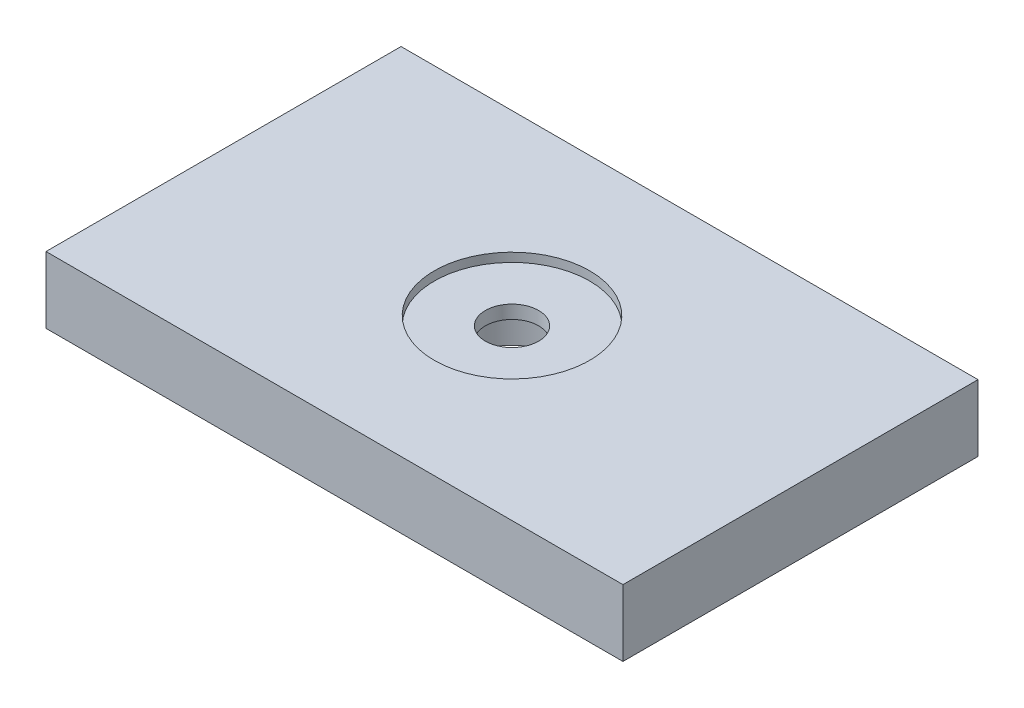
ISO-10303-21;
HEADER;
FILE_DESCRIPTION(('STEP AP214'),'2;1');
FILE_NAME('part.step','',(''),(''),'','','');
FILE_SCHEMA(('AUTOMOTIVE_DESIGN { 1 0 10303 214 1 1 1 1 }'));
ENDSEC;
DATA;
#1=APPLICATION_CONTEXT('core data for automotive mechanical design processes');
#2=APPLICATION_PROTOCOL_DEFINITION('international standard','automotive_design',2000,#1);
#3=PRODUCT_CONTEXT('',#1,'mechanical');
#4=PRODUCT('Part','Part','',(#3));
#5=PRODUCT_RELATED_PRODUCT_CATEGORY('part','',(#4));
#6=PRODUCT_DEFINITION_FORMATION('','',#4);
#7=PRODUCT_DEFINITION_CONTEXT('part definition',#1,'design');
#8=PRODUCT_DEFINITION('design','',#6,#7);
#9=PRODUCT_DEFINITION_SHAPE('','',#8);
#10=(LENGTH_UNIT() NAMED_UNIT(*) SI_UNIT(.MILLI.,.METRE.));
#11=(NAMED_UNIT(*) PLANE_ANGLE_UNIT() SI_UNIT($,.RADIAN.));
#12=(NAMED_UNIT(*) SI_UNIT($,.STERADIAN.) SOLID_ANGLE_UNIT());
#13=UNCERTAINTY_MEASURE_WITH_UNIT(LENGTH_MEASURE(1.E-05),#10,'distance_accuracy_value','');
#14=(GEOMETRIC_REPRESENTATION_CONTEXT(3) GLOBAL_UNCERTAINTY_ASSIGNED_CONTEXT((#13)) GLOBAL_UNIT_ASSIGNED_CONTEXT((#10,
#11,#12)) REPRESENTATION_CONTEXT('',''));
#15=CARTESIAN_POINT('',(0.,0.,0.));
#16=DIRECTION('',(0.,0.,1.));
#17=DIRECTION('',(1.,0.,0.));
#18=AXIS2_PLACEMENT_3D('',#15,#16,#17);
#19=CARTESIAN_POINT('',(65.,15.,-40.));
#20=DIRECTION('',(-1.,0.,0.));
#21=DIRECTION('',(0.,0.,1.));
#22=AXIS2_PLACEMENT_3D('',#19,#20,#21);
#23=PLANE('',#22);
#24=DIRECTION('',(0.,0.,-1.));
#25=VECTOR('',#24,1.);
#26=CARTESIAN_POINT('',(65.,0.,-40.));
#27=LINE('',#26,#25);
#28=CARTESIAN_POINT('',(65.,0.,40.));
#29=VERTEX_POINT('',#28);
#30=CARTESIAN_POINT('',(65.,0.,-40.));
#31=VERTEX_POINT('',#30);
#32=EDGE_CURVE('E115',#29,#31,#27,.T.);
#33=ORIENTED_EDGE('',*,*,#32,.T.);
#34=DIRECTION('',(0.,-1.,0.));
#35=VECTOR('',#34,1.);
#36=CARTESIAN_POINT('',(65.,15.,-40.));
#37=LINE('',#36,#35);
#38=CARTESIAN_POINT('',(65.,15.,-40.));
#39=VERTEX_POINT('',#38);
#40=EDGE_CURVE('E11',#39,#31,#37,.T.);
#41=ORIENTED_EDGE('',*,*,#40,.F.);
#42=DIRECTION('',(0.,0.,-1.));
#43=VECTOR('',#42,1.);
#44=CARTESIAN_POINT('',(65.,15.,-40.));
#45=LINE('',#44,#43);
#46=CARTESIAN_POINT('',(65.,15.,40.));
#47=VERTEX_POINT('',#46);
#48=EDGE_CURVE('E98',#47,#39,#45,.T.);
#49=ORIENTED_EDGE('',*,*,#48,.F.);
#50=DIRECTION('',(0.,-1.,0.));
#51=VECTOR('',#50,1.);
#52=CARTESIAN_POINT('',(65.,15.,40.));
#53=LINE('',#52,#51);
#54=EDGE_CURVE('E111',#47,#29,#53,.T.);
#55=ORIENTED_EDGE('',*,*,#54,.T.);
#56=EDGE_LOOP('',(#33,#41,#49,#55));
#57=FACE_BOUND('',#56,.T.);
#58=ADVANCED_FACE('F45',(#57),#23,.F.);
#59=CARTESIAN_POINT('',(-65.,15.,-40.));
#60=DIRECTION('',(0.,0.,1.));
#61=DIRECTION('',(1.,0.,0.));
#62=AXIS2_PLACEMENT_3D('',#59,#60,#61);
#63=PLANE('',#62);
#64=DIRECTION('',(-1.,0.,0.));
#65=VECTOR('',#64,1.);
#66=CARTESIAN_POINT('',(-65.,0.,-40.));
#67=LINE('',#66,#65);
#68=CARTESIAN_POINT('',(-65.,0.,-40.));
#69=VERTEX_POINT('',#68);
#70=EDGE_CURVE('E103',#31,#69,#67,.T.);
#71=ORIENTED_EDGE('',*,*,#70,.T.);
#72=DIRECTION('',(0.,-1.,0.));
#73=VECTOR('',#72,1.);
#74=CARTESIAN_POINT('',(-65.,15.,-40.));
#75=LINE('',#74,#73);
#76=CARTESIAN_POINT('',(-65.,15.,-40.));
#77=VERTEX_POINT('',#76);
#78=EDGE_CURVE('E55',#77,#69,#75,.T.);
#79=ORIENTED_EDGE('',*,*,#78,.F.);
#80=DIRECTION('',(-1.,0.,0.));
#81=VECTOR('',#80,1.);
#82=CARTESIAN_POINT('',(-65.,15.,-40.));
#83=LINE('',#82,#81);
#84=EDGE_CURVE('E93',#39,#77,#83,.T.);
#85=ORIENTED_EDGE('',*,*,#84,.F.);
#86=ORIENTED_EDGE('',*,*,#40,.T.);
#87=EDGE_LOOP('',(#71,#79,#85,#86));
#88=FACE_BOUND('',#87,.T.);
#89=ADVANCED_FACE('F102',(#88),#63,.F.);
#90=CARTESIAN_POINT('',(-65.,15.,-40.));
#91=DIRECTION('',(1.,0.,0.));
#92=DIRECTION('',(0.,0.,-1.));
#93=AXIS2_PLACEMENT_3D('',#90,#91,#92);
#94=PLANE('',#93);
#95=DIRECTION('',(0.,0.,1.));
#96=VECTOR('',#95,1.);
#97=CARTESIAN_POINT('',(-65.,0.,-40.));
#98=LINE('',#97,#96);
#99=CARTESIAN_POINT('',(-65.,0.,40.));
#100=VERTEX_POINT('',#99);
#101=EDGE_CURVE('E80',#69,#100,#98,.T.);
#102=ORIENTED_EDGE('',*,*,#101,.T.);
#103=DIRECTION('',(0.,-1.,0.));
#104=VECTOR('',#103,1.);
#105=CARTESIAN_POINT('',(-65.,15.,40.));
#106=LINE('',#105,#104);
#107=CARTESIAN_POINT('',(-65.,15.,40.));
#108=VERTEX_POINT('',#107);
#109=EDGE_CURVE('E105',#108,#100,#106,.T.);
#110=ORIENTED_EDGE('',*,*,#109,.F.);
#111=DIRECTION('',(0.,0.,1.));
#112=VECTOR('',#111,1.);
#113=CARTESIAN_POINT('',(-65.,15.,-40.));
#114=LINE('',#113,#112);
#115=EDGE_CURVE('E96',#77,#108,#114,.T.);
#116=ORIENTED_EDGE('',*,*,#115,.F.);
#117=ORIENTED_EDGE('',*,*,#78,.T.);
#118=EDGE_LOOP('',(#102,#110,#116,#117));
#119=FACE_BOUND('',#118,.T.);
#120=ADVANCED_FACE('F107',(#119),#94,.F.);
#121=CARTESIAN_POINT('',(-65.,15.,40.));
#122=DIRECTION('',(0.,0.,-1.));
#123=DIRECTION('',(-1.,0.,0.));
#124=AXIS2_PLACEMENT_3D('',#121,#122,#123);
#125=PLANE('',#124);
#126=DIRECTION('',(1.,0.,0.));
#127=VECTOR('',#126,1.);
#128=CARTESIAN_POINT('',(-65.,0.,40.));
#129=LINE('',#128,#127);
#130=EDGE_CURVE('E86',#100,#29,#129,.T.);
#131=ORIENTED_EDGE('',*,*,#130,.T.);
#132=ORIENTED_EDGE('',*,*,#54,.F.);
#133=DIRECTION('',(1.,0.,0.));
#134=VECTOR('',#133,1.);
#135=CARTESIAN_POINT('',(-65.,15.,40.));
#136=LINE('',#135,#134);
#137=EDGE_CURVE('E63',#108,#47,#136,.T.);
#138=ORIENTED_EDGE('',*,*,#137,.F.);
#139=ORIENTED_EDGE('',*,*,#109,.T.);
#140=EDGE_LOOP('',(#131,#132,#138,#139));
#141=FACE_BOUND('',#140,.T.);
#142=ADVANCED_FACE('F129',(#141),#125,.F.);
#143=CARTESIAN_POINT('',(0.,15.,0.));
#144=DIRECTION('',(0.,1.,0.));
#145=DIRECTION('',(0.,0.,1.));
#146=AXIS2_PLACEMENT_3D('',#143,#144,#145);
#147=PLANE('',#146);
#148=CARTESIAN_POINT('',(0.,15.,0.));
#149=DIRECTION('',(0.,1.,0.));
#150=DIRECTION('',(0.,0.,1.));
#151=AXIS2_PLACEMENT_3D('',#148,#149,#150);
#152=CIRCLE('',#151,17.5);
#153=CARTESIAN_POINT('',(0.,15.,17.5));
#154=VERTEX_POINT('',#153);
#155=EDGE_CURVE('E136',#154,#154,#152,.T.);
#156=ORIENTED_EDGE('',*,*,#155,.F.);
#157=EDGE_LOOP('',(#156));
#158=FACE_BOUND('',#157,.T.);
#159=ORIENTED_EDGE('',*,*,#48,.T.);
#160=ORIENTED_EDGE('',*,*,#84,.T.);
#161=ORIENTED_EDGE('',*,*,#115,.T.);
#162=ORIENTED_EDGE('',*,*,#137,.T.);
#163=EDGE_LOOP('',(#159,#160,#161,#162));
#164=FACE_BOUND('',#163,.T.);
#165=ADVANCED_FACE('F94',(#158,#164),#147,.T.);
#166=CARTESIAN_POINT('',(0.,0.,0.));
#167=DIRECTION('',(0.,1.,0.));
#168=DIRECTION('',(0.,0.,1.));
#169=AXIS2_PLACEMENT_3D('',#166,#167,#168);
#170=PLANE('',#169);
#171=CARTESIAN_POINT('',(0.,0.,0.));
#172=DIRECTION('',(0.,-1.,0.));
#173=DIRECTION('',(0.,0.,-1.));
#174=AXIS2_PLACEMENT_3D('',#171,#172,#173);
#175=CIRCLE('',#174,13.);
#176=CARTESIAN_POINT('',(0.,0.,-13.));
#177=VERTEX_POINT('',#176);
#178=EDGE_CURVE('E144',#177,#177,#175,.T.);
#179=ORIENTED_EDGE('',*,*,#178,.F.);
#180=EDGE_LOOP('',(#179));
#181=FACE_BOUND('',#180,.T.);
#182=ORIENTED_EDGE('',*,*,#32,.F.);
#183=ORIENTED_EDGE('',*,*,#130,.F.);
#184=ORIENTED_EDGE('',*,*,#101,.F.);
#185=ORIENTED_EDGE('',*,*,#70,.F.);
#186=EDGE_LOOP('',(#182,#183,#184,#185));
#187=FACE_BOUND('',#186,.T.);
#188=ADVANCED_FACE('F132',(#181,#187),#170,.F.);
#189=CARTESIAN_POINT('',(0.,13.,0.));
#190=DIRECTION('',(0.,1.,0.));
#191=DIRECTION('',(0.,0.,1.));
#192=AXIS2_PLACEMENT_3D('',#189,#190,#191);
#193=CYLINDRICAL_SURFACE('',#192,17.5);
#194=CARTESIAN_POINT('',(0.,13.,0.));
#195=DIRECTION('',(0.,1.,0.));
#196=DIRECTION('',(0.,0.,1.));
#197=AXIS2_PLACEMENT_3D('',#194,#195,#196);
#198=CIRCLE('',#197,17.5);
#199=CARTESIAN_POINT('',(0.,13.,17.5));
#200=VERTEX_POINT('',#199);
#201=EDGE_CURVE('E119',#200,#200,#198,.T.);
#202=ORIENTED_EDGE('',*,*,#201,.F.);
#203=EDGE_LOOP('',(#202));
#204=FACE_BOUND('',#203,.T.);
#205=ORIENTED_EDGE('',*,*,#155,.T.);
#206=EDGE_LOOP('',(#205));
#207=FACE_BOUND('',#206,.T.);
#208=ADVANCED_FACE('F176',(#204,#207),#193,.F.);
#209=CARTESIAN_POINT('',(0.,13.,0.));
#210=DIRECTION('',(0.,1.,0.));
#211=DIRECTION('',(0.,0.,1.));
#212=AXIS2_PLACEMENT_3D('',#209,#210,#211);
#213=PLANE('',#212);
#214=CARTESIAN_POINT('',(0.,13.,0.));
#215=DIRECTION('',(0.,1.,0.));
#216=DIRECTION('',(0.,0.,1.));
#217=AXIS2_PLACEMENT_3D('',#214,#215,#216);
#218=CIRCLE('',#217,6.);
#219=CARTESIAN_POINT('',(0.,13.,6.));
#220=VERTEX_POINT('',#219);
#221=EDGE_CURVE('E151',#220,#220,#218,.T.);
#222=ORIENTED_EDGE('',*,*,#221,.F.);
#223=EDGE_LOOP('',(#222));
#224=FACE_BOUND('',#223,.T.);
#225=ORIENTED_EDGE('',*,*,#201,.T.);
#226=EDGE_LOOP('',(#225));
#227=FACE_BOUND('',#226,.T.);
#228=ADVANCED_FACE('F171',(#224,#227),#213,.T.);
#229=CARTESIAN_POINT('',(0.,10.,0.));
#230=DIRECTION('',(0.,-1.,0.));
#231=DIRECTION('',(0.,0.,-1.));
#232=AXIS2_PLACEMENT_3D('',#229,#230,#231);
#233=CYLINDRICAL_SURFACE('',#232,13.);
#234=CARTESIAN_POINT('',(0.,10.,0.));
#235=DIRECTION('',(0.,-1.,0.));
#236=DIRECTION('',(0.,0.,-1.));
#237=AXIS2_PLACEMENT_3D('',#234,#235,#236);
#238=CIRCLE('',#237,13.);
#239=CARTESIAN_POINT('',(0.,10.,-13.));
#240=VERTEX_POINT('',#239);
#241=EDGE_CURVE('E140',#240,#240,#238,.T.);
#242=ORIENTED_EDGE('',*,*,#241,.F.);
#243=EDGE_LOOP('',(#242));
#244=FACE_BOUND('',#243,.T.);
#245=ORIENTED_EDGE('',*,*,#178,.T.);
#246=EDGE_LOOP('',(#245));
#247=FACE_BOUND('',#246,.T.);
#248=ADVANCED_FACE('F165',(#244,#247),#233,.F.);
#249=CARTESIAN_POINT('',(0.,10.,0.));
#250=DIRECTION('',(0.,-1.,0.));
#251=DIRECTION('',(0.,0.,-1.));
#252=AXIS2_PLACEMENT_3D('',#249,#250,#251);
#253=PLANE('',#252);
#254=CARTESIAN_POINT('',(0.,10.,0.));
#255=DIRECTION('',(0.,-1.,0.));
#256=DIRECTION('',(0.,0.,-1.));
#257=AXIS2_PLACEMENT_3D('',#254,#255,#256);
#258=CIRCLE('',#257,6.);
#259=CARTESIAN_POINT('',(0.,10.,6.));
#260=VERTEX_POINT('',#259);
#261=EDGE_CURVE('E48',#260,#260,#258,.T.);
#262=ORIENTED_EDGE('',*,*,#261,.F.);
#263=EDGE_LOOP('',(#262));
#264=FACE_BOUND('',#263,.T.);
#265=ORIENTED_EDGE('',*,*,#241,.T.);
#266=EDGE_LOOP('',(#265));
#267=FACE_BOUND('',#266,.T.);
#268=ADVANCED_FACE('F162',(#264,#267),#253,.T.);
#269=CARTESIAN_POINT('',(0.,0.,0.));
#270=DIRECTION('',(0.,1.,0.));
#271=DIRECTION('',(0.,0.,1.));
#272=AXIS2_PLACEMENT_3D('',#269,#270,#271);
#273=CYLINDRICAL_SURFACE('',#272,6.);
#274=CARTESIAN_POINT('',(0.,10.,6.));
#275=CARTESIAN_POINT('',(0.,10.03125,6.));
#276=CARTESIAN_POINT('',(0.,10.0625,6.));
#277=CARTESIAN_POINT('',(0.,10.125,6.));
#278=CARTESIAN_POINT('',(0.,10.15625,6.));
#279=CARTESIAN_POINT('',(0.,10.21875,6.));
#280=CARTESIAN_POINT('',(0.,10.25,6.));
#281=CARTESIAN_POINT('',(0.,10.3125,6.));
#282=CARTESIAN_POINT('',(0.,10.34375,6.));
#283=CARTESIAN_POINT('',(0.,10.40625,6.));
#284=CARTESIAN_POINT('',(0.,10.4375,6.));
#285=CARTESIAN_POINT('',(0.,10.5,6.));
#286=CARTESIAN_POINT('',(0.,10.53125,6.));
#287=CARTESIAN_POINT('',(0.,10.59375,6.));
#288=CARTESIAN_POINT('',(0.,10.625,6.));
#289=CARTESIAN_POINT('',(0.,10.6875,6.));
#290=CARTESIAN_POINT('',(0.,10.71875,6.));
#291=CARTESIAN_POINT('',(0.,10.78125,6.));
#292=CARTESIAN_POINT('',(0.,10.8125,6.));
#293=CARTESIAN_POINT('',(0.,10.875,6.));
#294=CARTESIAN_POINT('',(0.,10.90625,6.));
#295=CARTESIAN_POINT('',(0.,10.96875,6.));
#296=CARTESIAN_POINT('',(0.,11.,6.));
#297=CARTESIAN_POINT('',(0.,11.0625,6.));
#298=CARTESIAN_POINT('',(0.,11.09375,6.));
#299=CARTESIAN_POINT('',(0.,11.15625,6.));
#300=CARTESIAN_POINT('',(0.,11.1875,6.));
#301=CARTESIAN_POINT('',(0.,11.25,6.));
#302=CARTESIAN_POINT('',(0.,11.28125,6.));
#303=CARTESIAN_POINT('',(0.,11.34375,6.));
#304=CARTESIAN_POINT('',(0.,11.375,6.));
#305=CARTESIAN_POINT('',(0.,11.4375,6.));
#306=CARTESIAN_POINT('',(0.,11.46875,6.));
#307=CARTESIAN_POINT('',(0.,11.53125,6.));
#308=CARTESIAN_POINT('',(0.,11.5625,6.));
#309=CARTESIAN_POINT('',(0.,11.625,6.));
#310=CARTESIAN_POINT('',(0.,11.65625,6.));
#311=CARTESIAN_POINT('',(0.,11.71875,6.));
#312=CARTESIAN_POINT('',(0.,11.75,6.));
#313=CARTESIAN_POINT('',(0.,11.8125,6.));
#314=CARTESIAN_POINT('',(0.,11.84375,6.));
#315=CARTESIAN_POINT('',(0.,11.90625,6.));
#316=CARTESIAN_POINT('',(0.,11.9375,6.));
#317=CARTESIAN_POINT('',(0.,12.,6.));
#318=CARTESIAN_POINT('',(0.,12.03125,6.));
#319=CARTESIAN_POINT('',(0.,12.09375,6.));
#320=CARTESIAN_POINT('',(0.,12.125,6.));
#321=CARTESIAN_POINT('',(0.,12.1875,6.));
#322=CARTESIAN_POINT('',(0.,12.21875,6.));
#323=CARTESIAN_POINT('',(0.,12.28125,6.));
#324=CARTESIAN_POINT('',(0.,12.3125,6.));
#325=CARTESIAN_POINT('',(0.,12.375,6.));
#326=CARTESIAN_POINT('',(0.,12.40625,6.));
#327=CARTESIAN_POINT('',(0.,12.46875,6.));
#328=CARTESIAN_POINT('',(0.,12.5,6.));
#329=CARTESIAN_POINT('',(0.,12.5625,6.));
#330=CARTESIAN_POINT('',(0.,12.59375,6.));
#331=CARTESIAN_POINT('',(0.,12.65625,6.));
#332=CARTESIAN_POINT('',(0.,12.6875,6.));
#333=CARTESIAN_POINT('',(0.,12.75,6.));
#334=CARTESIAN_POINT('',(0.,12.78125,6.));
#335=CARTESIAN_POINT('',(0.,12.84375,6.));
#336=CARTESIAN_POINT('',(0.,12.875,6.));
#337=CARTESIAN_POINT('',(0.,12.9375,6.));
#338=CARTESIAN_POINT('',(0.,12.96875,6.));
#339=CARTESIAN_POINT('',(0.,13.,6.));
#340=B_SPLINE_CURVE_WITH_KNOTS('',3,(#274,#275,#276,#277,#278,#279,#280,#281,#282,#283,#284,
#285,#286,#287,#288,#289,#290,#291,#292,#293,#294,#295,#296,#297,#298,#299,#300,#301,#302,#303,
#304,#305,#306,#307,#308,#309,#310,#311,#312,#313,#314,#315,#316,#317,#318,#319,#320,#321,#322,
#323,#324,#325,#326,#327,#328,#329,#330,#331,#332,#333,#334,#335,#336,#337,#338,#339),
.UNSPECIFIED.,.F.,.F.,(4,2,2,2,2,2,2,2,2,2,2,2,2,2,2,2,2,2,2,2,2,2,2,2,2,2,2,2,2,2,2,2,4),(0.,
0.0937500000000001,0.1875,0.28125,0.375,0.46875,0.5625,0.656250000000001,0.750000000000001,
0.843749999999999,0.937499999999999,1.03125,1.125,1.21875,1.3125,1.40625,1.5,1.59375,1.6875,
1.78125,1.875,1.96875,2.0625,2.15625,2.25,2.34375,2.4375,2.53125,2.625,2.71875,2.8125,2.90625,
3.),.UNSPECIFIED.);
#341=EDGE_CURVE('BSEAM160',#260,#220,#340,.T.);
#342=ORIENTED_EDGE('',*,*,#261,.T.);
#343=ORIENTED_EDGE('',*,*,#221,.T.);
#344=ORIENTED_EDGE('',*,*,#341,.T.);
#345=ORIENTED_EDGE('',*,*,#341,.F.);
#346=EDGE_LOOP('',(#342,#344,#343,#345));
#347=FACE_BOUND('',#346,.T.);
#348=ADVANCED_FACE('F160',(#347),#273,.F.);
#349=CLOSED_SHELL('',(#58,#89,#120,#142,#165,#188,#208,#228,#248,#268,#348));
#350=MANIFOLD_SOLID_BREP('B2',#349);
#351=ADVANCED_BREP_SHAPE_REPRESENTATION('',(#18,#350),#14);
#352=SHAPE_DEFINITION_REPRESENTATION(#9,#351);
ENDSEC;
END-ISO-10303-21;
